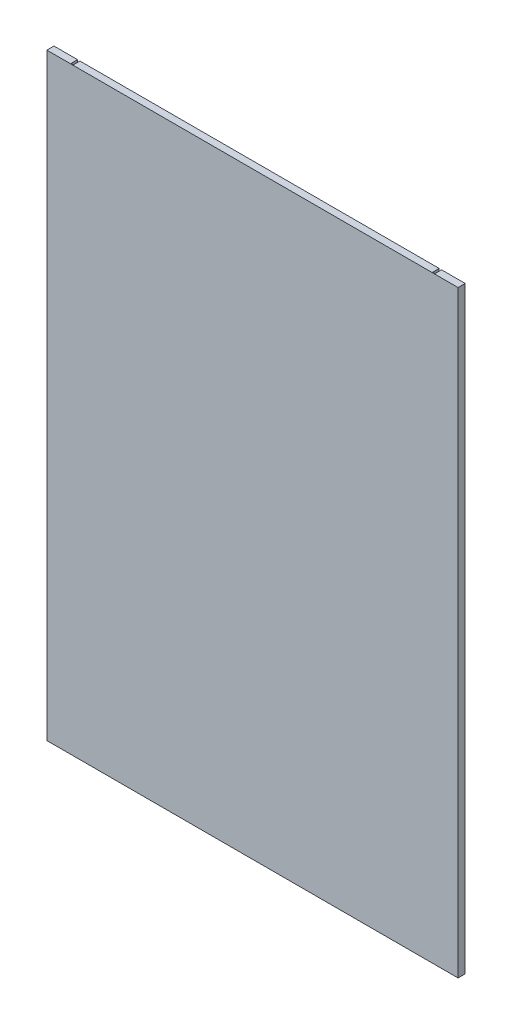
ISO-10303-21;
HEADER;
FILE_DESCRIPTION(('STEP AP214'),'2;1');
FILE_NAME('part.step','',(''),(''),'','','');
FILE_SCHEMA(('AUTOMOTIVE_DESIGN { 1 0 10303 214 1 1 1 1 }'));
ENDSEC;
DATA;
#1=APPLICATION_CONTEXT('core data for automotive mechanical design processes');
#2=APPLICATION_PROTOCOL_DEFINITION('international standard','automotive_design',2000,#1);
#3=PRODUCT_CONTEXT('',#1,'mechanical');
#4=PRODUCT('Part','Part','',(#3));
#5=PRODUCT_RELATED_PRODUCT_CATEGORY('part','',(#4));
#6=PRODUCT_DEFINITION_FORMATION('','',#4);
#7=PRODUCT_DEFINITION_CONTEXT('part definition',#1,'design');
#8=PRODUCT_DEFINITION('design','',#6,#7);
#9=PRODUCT_DEFINITION_SHAPE('','',#8);
#10=(LENGTH_UNIT() NAMED_UNIT(*) SI_UNIT(.MILLI.,.METRE.));
#11=(NAMED_UNIT(*) PLANE_ANGLE_UNIT() SI_UNIT($,.RADIAN.));
#12=(NAMED_UNIT(*) SI_UNIT($,.STERADIAN.) SOLID_ANGLE_UNIT());
#13=UNCERTAINTY_MEASURE_WITH_UNIT(LENGTH_MEASURE(1.E-05),#10,'distance_accuracy_value','');
#14=(GEOMETRIC_REPRESENTATION_CONTEXT(3) GLOBAL_UNCERTAINTY_ASSIGNED_CONTEXT((#13)) GLOBAL_UNIT_ASSIGNED_CONTEXT((#10,
#11,#12)) REPRESENTATION_CONTEXT('',''));
#15=CARTESIAN_POINT('',(0.,0.,0.));
#16=DIRECTION('',(0.,0.,1.));
#17=DIRECTION('',(1.,0.,0.));
#18=AXIS2_PLACEMENT_3D('',#15,#16,#17);
#19=CARTESIAN_POINT('',(87.,253.,0.));
#20=DIRECTION('',(0.,0.,-1.));
#21=DIRECTION('',(-1.,0.,0.));
#22=AXIS2_PLACEMENT_3D('',#19,#20,#21);
#23=PLANE('',#22);
#24=DIRECTION('',(1.,0.,0.));
#25=VECTOR('',#24,1.);
#26=CARTESIAN_POINT('',(87.,0.,0.));
#27=LINE('',#26,#25);
#28=CARTESIAN_POINT('',(-87.,0.,0.));
#29=VERTEX_POINT('',#28);
#30=CARTESIAN_POINT('',(87.,0.,0.));
#31=VERTEX_POINT('',#30);
#32=EDGE_CURVE('E157',#29,#31,#27,.T.);
#33=ORIENTED_EDGE('',*,*,#32,.T.);
#34=DIRECTION('',(0.,-1.,0.));
#35=VECTOR('',#34,1.);
#36=CARTESIAN_POINT('',(87.,253.,0.));
#37=LINE('',#36,#35);
#38=CARTESIAN_POINT('',(87.,253.,0.));
#39=VERTEX_POINT('',#38);
#40=EDGE_CURVE('E11',#39,#31,#37,.T.);
#41=ORIENTED_EDGE('',*,*,#40,.F.);
#42=DIRECTION('',(1.,0.,0.));
#43=VECTOR('',#42,1.);
#44=CARTESIAN_POINT('',(87.,253.,0.));
#45=LINE('',#44,#43);
#46=CARTESIAN_POINT('',(-87.,253.,0.));
#47=VERTEX_POINT('',#46);
#48=EDGE_CURVE('E179',#47,#39,#45,.T.);
#49=ORIENTED_EDGE('',*,*,#48,.F.);
#50=DIRECTION('',(0.,-1.,0.));
#51=VECTOR('',#50,1.);
#52=CARTESIAN_POINT('',(-87.,253.,0.));
#53=LINE('',#52,#51);
#54=EDGE_CURVE('E153',#47,#29,#53,.T.);
#55=ORIENTED_EDGE('',*,*,#54,.T.);
#56=EDGE_LOOP('',(#33,#41,#49,#55));
#57=FACE_BOUND('',#56,.T.);
#58=ADVANCED_FACE('F37',(#57),#23,.F.);
#59=CARTESIAN_POINT('',(87.,253.,-2.99999999999998));
#60=DIRECTION('',(-1.,0.,0.));
#61=DIRECTION('',(0.,0.,1.));
#62=AXIS2_PLACEMENT_3D('',#59,#60,#61);
#63=PLANE('',#62);
#64=DIRECTION('',(0.,0.,-1.));
#65=VECTOR('',#64,1.);
#66=CARTESIAN_POINT('',(87.,0.,-2.99999999999998));
#67=LINE('',#66,#65);
#68=CARTESIAN_POINT('',(87.,0.,-2.99999999999998));
#69=VERTEX_POINT('',#68);
#70=EDGE_CURVE('E160',#31,#69,#67,.T.);
#71=ORIENTED_EDGE('',*,*,#70,.T.);
#72=DIRECTION('',(0.,-1.,0.));
#73=VECTOR('',#72,1.);
#74=CARTESIAN_POINT('',(87.,253.,-2.99999999999998));
#75=LINE('',#74,#73);
#76=CARTESIAN_POINT('',(87.,253.,-2.99999999999998));
#77=VERTEX_POINT('',#76);
#78=EDGE_CURVE('E45',#77,#69,#75,.T.);
#79=ORIENTED_EDGE('',*,*,#78,.F.);
#80=DIRECTION('',(0.,0.,-1.));
#81=VECTOR('',#80,1.);
#82=CARTESIAN_POINT('',(87.,253.,-2.99999999999998));
#83=LINE('',#82,#81);
#84=EDGE_CURVE('E108',#39,#77,#83,.T.);
#85=ORIENTED_EDGE('',*,*,#84,.F.);
#86=ORIENTED_EDGE('',*,*,#40,.T.);
#87=EDGE_LOOP('',(#71,#79,#85,#86));
#88=FACE_BOUND('',#87,.T.);
#89=ADVANCED_FACE('F257',(#88),#63,.F.);
#90=CARTESIAN_POINT('',(77.,253.,-2.99999999999998));
#91=DIRECTION('',(0.,0.,1.));
#92=DIRECTION('',(1.,0.,0.));
#93=AXIS2_PLACEMENT_3D('',#90,#91,#92);
#94=PLANE('',#93);
#95=DIRECTION('',(-1.,0.,0.));
#96=VECTOR('',#95,1.);
#97=CARTESIAN_POINT('',(77.,0.,-2.99999999999998));
#98=LINE('',#97,#96);
#99=CARTESIAN_POINT('',(77.,0.,-2.99999999999998));
#100=VERTEX_POINT('',#99);
#101=EDGE_CURVE('E162',#69,#100,#98,.T.);
#102=ORIENTED_EDGE('',*,*,#101,.T.);
#103=DIRECTION('',(0.,-1.,0.));
#104=VECTOR('',#103,1.);
#105=CARTESIAN_POINT('',(77.,253.,-2.99999999999998));
#106=LINE('',#105,#104);
#107=CARTESIAN_POINT('',(77.,253.,-2.99999999999998));
#108=VERTEX_POINT('',#107);
#109=EDGE_CURVE('E198',#108,#100,#106,.T.);
#110=ORIENTED_EDGE('',*,*,#109,.F.);
#111=DIRECTION('',(-1.,0.,0.));
#112=VECTOR('',#111,1.);
#113=CARTESIAN_POINT('',(77.,253.,-2.99999999999998));
#114=LINE('',#113,#112);
#115=EDGE_CURVE('E206',#77,#108,#114,.T.);
#116=ORIENTED_EDGE('',*,*,#115,.F.);
#117=ORIENTED_EDGE('',*,*,#78,.T.);
#118=EDGE_LOOP('',(#102,#110,#116,#117));
#119=FACE_BOUND('',#118,.T.);
#120=ADVANCED_FACE('F204',(#119),#94,.F.);
#121=CARTESIAN_POINT('',(77.,253.,-0.19999999999998));
#122=DIRECTION('',(1.,0.,0.));
#123=DIRECTION('',(0.,0.,-1.));
#124=AXIS2_PLACEMENT_3D('',#121,#122,#123);
#125=PLANE('',#124);
#126=DIRECTION('',(0.,0.,1.));
#127=VECTOR('',#126,1.);
#128=CARTESIAN_POINT('',(77.,0.,-0.19999999999998));
#129=LINE('',#128,#127);
#130=CARTESIAN_POINT('',(77.,0.,-0.19999999999998));
#131=VERTEX_POINT('',#130);
#132=EDGE_CURVE('E164',#100,#131,#129,.T.);
#133=ORIENTED_EDGE('',*,*,#132,.T.);
#134=DIRECTION('',(0.,-1.,0.));
#135=VECTOR('',#134,1.);
#136=CARTESIAN_POINT('',(77.,253.,-0.19999999999998));
#137=LINE('',#136,#135);
#138=CARTESIAN_POINT('',(77.,253.,-0.19999999999998));
#139=VERTEX_POINT('',#138);
#140=EDGE_CURVE('E195',#139,#131,#137,.T.);
#141=ORIENTED_EDGE('',*,*,#140,.F.);
#142=DIRECTION('',(0.,0.,1.));
#143=VECTOR('',#142,1.);
#144=CARTESIAN_POINT('',(77.,253.,-0.19999999999998));
#145=LINE('',#144,#143);
#146=EDGE_CURVE('E224',#108,#139,#145,.T.);
#147=ORIENTED_EDGE('',*,*,#146,.F.);
#148=ORIENTED_EDGE('',*,*,#109,.T.);
#149=EDGE_LOOP('',(#133,#141,#147,#148));
#150=FACE_BOUND('',#149,.T.);
#151=ADVANCED_FACE('F215',(#150),#125,.F.);
#152=CARTESIAN_POINT('',(76.,253.,-0.199999999999991));
#153=DIRECTION('',(0.,0.,1.));
#154=DIRECTION('',(1.,0.,0.));
#155=AXIS2_PLACEMENT_3D('',#152,#153,#154);
#156=PLANE('',#155);
#157=DIRECTION('',(-1.,0.,0.));
#158=VECTOR('',#157,1.);
#159=CARTESIAN_POINT('',(76.,0.,-0.199999999999991));
#160=LINE('',#159,#158);
#161=CARTESIAN_POINT('',(76.,0.,-0.199999999999991));
#162=VERTEX_POINT('',#161);
#163=EDGE_CURVE('E166',#131,#162,#160,.T.);
#164=ORIENTED_EDGE('',*,*,#163,.T.);
#165=DIRECTION('',(0.,-1.,0.));
#166=VECTOR('',#165,1.);
#167=CARTESIAN_POINT('',(76.,253.,-0.199999999999991));
#168=LINE('',#167,#166);
#169=CARTESIAN_POINT('',(76.,253.,-0.199999999999991));
#170=VERTEX_POINT('',#169);
#171=EDGE_CURVE('E192',#170,#162,#168,.T.);
#172=ORIENTED_EDGE('',*,*,#171,.F.);
#173=DIRECTION('',(-1.,0.,0.));
#174=VECTOR('',#173,1.);
#175=CARTESIAN_POINT('',(76.,253.,-0.199999999999991));
#176=LINE('',#175,#174);
#177=EDGE_CURVE('E221',#139,#170,#176,.T.);
#178=ORIENTED_EDGE('',*,*,#177,.F.);
#179=ORIENTED_EDGE('',*,*,#140,.T.);
#180=EDGE_LOOP('',(#164,#172,#178,#179));
#181=FACE_BOUND('',#180,.T.);
#182=ADVANCED_FACE('F219',(#181),#156,.F.);
#183=CARTESIAN_POINT('',(76.,253.,-2.99999999999999));
#184=DIRECTION('',(-1.,0.,0.));
#185=DIRECTION('',(0.,0.,1.));
#186=AXIS2_PLACEMENT_3D('',#183,#184,#185);
#187=PLANE('',#186);
#188=DIRECTION('',(0.,0.,-1.));
#189=VECTOR('',#188,1.);
#190=CARTESIAN_POINT('',(76.,0.,-2.99999999999999));
#191=LINE('',#190,#189);
#192=CARTESIAN_POINT('',(76.,0.,-2.99999999999999));
#193=VERTEX_POINT('',#192);
#194=EDGE_CURVE('E168',#162,#193,#191,.T.);
#195=ORIENTED_EDGE('',*,*,#194,.T.);
#196=DIRECTION('',(0.,-1.,0.));
#197=VECTOR('',#196,1.);
#198=CARTESIAN_POINT('',(76.,253.,-2.99999999999999));
#199=LINE('',#198,#197);
#200=CARTESIAN_POINT('',(76.,253.,-2.99999999999999));
#201=VERTEX_POINT('',#200);
#202=EDGE_CURVE('E189',#201,#193,#199,.T.);
#203=ORIENTED_EDGE('',*,*,#202,.F.);
#204=DIRECTION('',(0.,0.,-1.));
#205=VECTOR('',#204,1.);
#206=CARTESIAN_POINT('',(76.,253.,-2.99999999999999));
#207=LINE('',#206,#205);
#208=EDGE_CURVE('E223',#170,#201,#207,.T.);
#209=ORIENTED_EDGE('',*,*,#208,.F.);
#210=ORIENTED_EDGE('',*,*,#171,.T.);
#211=EDGE_LOOP('',(#195,#203,#209,#210));
#212=FACE_BOUND('',#211,.T.);
#213=ADVANCED_FACE('F270',(#212),#187,.F.);
#214=CARTESIAN_POINT('',(-76.,253.,-2.99999999999999));
#215=DIRECTION('',(0.,0.,1.));
#216=DIRECTION('',(1.,0.,0.));
#217=AXIS2_PLACEMENT_3D('',#214,#215,#216);
#218=PLANE('',#217);
#219=DIRECTION('',(-1.,0.,0.));
#220=VECTOR('',#219,1.);
#221=CARTESIAN_POINT('',(-76.,0.,-2.99999999999999));
#222=LINE('',#221,#220);
#223=CARTESIAN_POINT('',(-76.,0.,-2.99999999999999));
#224=VERTEX_POINT('',#223);
#225=EDGE_CURVE('E170',#193,#224,#222,.T.);
#226=ORIENTED_EDGE('',*,*,#225,.T.);
#227=DIRECTION('',(0.,-1.,0.));
#228=VECTOR('',#227,1.);
#229=CARTESIAN_POINT('',(-76.,253.,-2.99999999999999));
#230=LINE('',#229,#228);
#231=CARTESIAN_POINT('',(-76.,253.,-2.99999999999999));
#232=VERTEX_POINT('',#231);
#233=EDGE_CURVE('E186',#232,#224,#230,.T.);
#234=ORIENTED_EDGE('',*,*,#233,.F.);
#235=DIRECTION('',(-1.,0.,0.));
#236=VECTOR('',#235,1.);
#237=CARTESIAN_POINT('',(-76.,253.,-2.99999999999999));
#238=LINE('',#237,#236);
#239=EDGE_CURVE('E226',#201,#232,#238,.T.);
#240=ORIENTED_EDGE('',*,*,#239,.F.);
#241=ORIENTED_EDGE('',*,*,#202,.T.);
#242=EDGE_LOOP('',(#226,#234,#240,#241));
#243=FACE_BOUND('',#242,.T.);
#244=ADVANCED_FACE('F273',(#243),#218,.F.);
#245=CARTESIAN_POINT('',(-76.,253.,-0.199999999999991));
#246=DIRECTION('',(1.,0.,0.));
#247=DIRECTION('',(0.,0.,-1.));
#248=AXIS2_PLACEMENT_3D('',#245,#246,#247);
#249=PLANE('',#248);
#250=DIRECTION('',(0.,0.,1.));
#251=VECTOR('',#250,1.);
#252=CARTESIAN_POINT('',(-76.,0.,-0.199999999999991));
#253=LINE('',#252,#251);
#254=CARTESIAN_POINT('',(-76.,0.,-0.199999999999991));
#255=VERTEX_POINT('',#254);
#256=EDGE_CURVE('E172',#224,#255,#253,.T.);
#257=ORIENTED_EDGE('',*,*,#256,.T.);
#258=DIRECTION('',(0.,-1.,0.));
#259=VECTOR('',#258,1.);
#260=CARTESIAN_POINT('',(-76.,253.,-0.199999999999991));
#261=LINE('',#260,#259);
#262=CARTESIAN_POINT('',(-76.,253.,-0.199999999999991));
#263=VERTEX_POINT('',#262);
#264=EDGE_CURVE('E183',#263,#255,#261,.T.);
#265=ORIENTED_EDGE('',*,*,#264,.F.);
#266=DIRECTION('',(0.,0.,1.));
#267=VECTOR('',#266,1.);
#268=CARTESIAN_POINT('',(-76.,253.,-0.199999999999991));
#269=LINE('',#268,#267);
#270=EDGE_CURVE('E232',#232,#263,#269,.T.);
#271=ORIENTED_EDGE('',*,*,#270,.F.);
#272=ORIENTED_EDGE('',*,*,#233,.T.);
#273=EDGE_LOOP('',(#257,#265,#271,#272));
#274=FACE_BOUND('',#273,.T.);
#275=ADVANCED_FACE('F238',(#274),#249,.F.);
#276=CARTESIAN_POINT('',(-77.,253.,-0.19999999999998));
#277=DIRECTION('',(0.,0.,1.));
#278=DIRECTION('',(1.,0.,0.));
#279=AXIS2_PLACEMENT_3D('',#276,#277,#278);
#280=PLANE('',#279);
#281=DIRECTION('',(-1.,0.,0.));
#282=VECTOR('',#281,1.);
#283=CARTESIAN_POINT('',(-77.,0.,-0.19999999999998));
#284=LINE('',#283,#282);
#285=CARTESIAN_POINT('',(-77.,0.,-0.19999999999998));
#286=VERTEX_POINT('',#285);
#287=EDGE_CURVE('E174',#255,#286,#284,.T.);
#288=ORIENTED_EDGE('',*,*,#287,.T.);
#289=DIRECTION('',(0.,-1.,0.));
#290=VECTOR('',#289,1.);
#291=CARTESIAN_POINT('',(-77.,253.,-0.19999999999998));
#292=LINE('',#291,#290);
#293=CARTESIAN_POINT('',(-77.,253.,-0.19999999999998));
#294=VERTEX_POINT('',#293);
#295=EDGE_CURVE('E148',#294,#286,#292,.T.);
#296=ORIENTED_EDGE('',*,*,#295,.F.);
#297=DIRECTION('',(-1.,0.,0.));
#298=VECTOR('',#297,1.);
#299=CARTESIAN_POINT('',(-77.,253.,-0.19999999999998));
#300=LINE('',#299,#298);
#301=EDGE_CURVE('E139',#263,#294,#300,.T.);
#302=ORIENTED_EDGE('',*,*,#301,.F.);
#303=ORIENTED_EDGE('',*,*,#264,.T.);
#304=EDGE_LOOP('',(#288,#296,#302,#303));
#305=FACE_BOUND('',#304,.T.);
#306=ADVANCED_FACE('F242',(#305),#280,.F.);
#307=CARTESIAN_POINT('',(-77.,253.,-2.99999999999998));
#308=DIRECTION('',(-1.,0.,0.));
#309=DIRECTION('',(0.,0.,1.));
#310=AXIS2_PLACEMENT_3D('',#307,#308,#309);
#311=PLANE('',#310);
#312=DIRECTION('',(0.,0.,-1.));
#313=VECTOR('',#312,1.);
#314=CARTESIAN_POINT('',(-77.,0.,-2.99999999999998));
#315=LINE('',#314,#313);
#316=CARTESIAN_POINT('',(-77.,0.,-2.99999999999998));
#317=VERTEX_POINT('',#316);
#318=EDGE_CURVE('E147',#286,#317,#315,.T.);
#319=ORIENTED_EDGE('',*,*,#318,.T.);
#320=DIRECTION('',(0.,-1.,0.));
#321=VECTOR('',#320,1.);
#322=CARTESIAN_POINT('',(-77.,253.,-2.99999999999998));
#323=LINE('',#322,#321);
#324=CARTESIAN_POINT('',(-77.,253.,-2.99999999999998));
#325=VERTEX_POINT('',#324);
#326=EDGE_CURVE('E144',#325,#317,#323,.T.);
#327=ORIENTED_EDGE('',*,*,#326,.F.);
#328=DIRECTION('',(0.,0.,-1.));
#329=VECTOR('',#328,1.);
#330=CARTESIAN_POINT('',(-77.,253.,-2.99999999999998));
#331=LINE('',#330,#329);
#332=EDGE_CURVE('E133',#294,#325,#331,.T.);
#333=ORIENTED_EDGE('',*,*,#332,.F.);
#334=ORIENTED_EDGE('',*,*,#295,.T.);
#335=EDGE_LOOP('',(#319,#327,#333,#334));
#336=FACE_BOUND('',#335,.T.);
#337=ADVANCED_FACE('F145',(#336),#311,.F.);
#338=CARTESIAN_POINT('',(-87.,253.,-2.99999999999998));
#339=DIRECTION('',(0.,0.,1.));
#340=DIRECTION('',(1.,0.,0.));
#341=AXIS2_PLACEMENT_3D('',#338,#339,#340);
#342=PLANE('',#341);
#343=DIRECTION('',(-1.,0.,0.));
#344=VECTOR('',#343,1.);
#345=CARTESIAN_POINT('',(-87.,0.,-2.99999999999998));
#346=LINE('',#345,#344);
#347=CARTESIAN_POINT('',(-87.,0.,-2.99999999999998));
#348=VERTEX_POINT('',#347);
#349=EDGE_CURVE('E94',#317,#348,#346,.T.);
#350=ORIENTED_EDGE('',*,*,#349,.T.);
#351=DIRECTION('',(0.,-1.,0.));
#352=VECTOR('',#351,1.);
#353=CARTESIAN_POINT('',(-87.,253.,-2.99999999999998));
#354=LINE('',#353,#352);
#355=CARTESIAN_POINT('',(-87.,253.,-2.99999999999998));
#356=VERTEX_POINT('',#355);
#357=EDGE_CURVE('E149',#356,#348,#354,.T.);
#358=ORIENTED_EDGE('',*,*,#357,.F.);
#359=DIRECTION('',(-1.,0.,0.));
#360=VECTOR('',#359,1.);
#361=CARTESIAN_POINT('',(-87.,253.,-2.99999999999998));
#362=LINE('',#361,#360);
#363=EDGE_CURVE('E137',#325,#356,#362,.T.);
#364=ORIENTED_EDGE('',*,*,#363,.F.);
#365=ORIENTED_EDGE('',*,*,#326,.T.);
#366=EDGE_LOOP('',(#350,#358,#364,#365));
#367=FACE_BOUND('',#366,.T.);
#368=ADVANCED_FACE('F151',(#367),#342,.F.);
#369=CARTESIAN_POINT('',(-87.,253.,0.));
#370=DIRECTION('',(1.,0.,0.));
#371=DIRECTION('',(0.,0.,-1.));
#372=AXIS2_PLACEMENT_3D('',#369,#370,#371);
#373=PLANE('',#372);
#374=DIRECTION('',(0.,0.,1.));
#375=VECTOR('',#374,1.);
#376=CARTESIAN_POINT('',(-87.,0.,0.));
#377=LINE('',#376,#375);
#378=EDGE_CURVE('E100',#348,#29,#377,.T.);
#379=ORIENTED_EDGE('',*,*,#378,.T.);
#380=ORIENTED_EDGE('',*,*,#54,.F.);
#381=DIRECTION('',(0.,0.,1.));
#382=VECTOR('',#381,1.);
#383=CARTESIAN_POINT('',(-87.,253.,0.));
#384=LINE('',#383,#382);
#385=EDGE_CURVE('E53',#356,#47,#384,.T.);
#386=ORIENTED_EDGE('',*,*,#385,.F.);
#387=ORIENTED_EDGE('',*,*,#357,.T.);
#388=EDGE_LOOP('',(#379,#380,#386,#387));
#389=FACE_BOUND('',#388,.T.);
#390=ADVANCED_FACE('F246',(#389),#373,.F.);
#391=CARTESIAN_POINT('',(0.,253.,0.));
#392=DIRECTION('',(0.,-1.,0.));
#393=DIRECTION('',(0.,0.,-1.));
#394=AXIS2_PLACEMENT_3D('',#391,#392,#393);
#395=PLANE('',#394);
#396=ORIENTED_EDGE('',*,*,#48,.T.);
#397=ORIENTED_EDGE('',*,*,#84,.T.);
#398=ORIENTED_EDGE('',*,*,#115,.T.);
#399=ORIENTED_EDGE('',*,*,#146,.T.);
#400=ORIENTED_EDGE('',*,*,#177,.T.);
#401=ORIENTED_EDGE('',*,*,#208,.T.);
#402=ORIENTED_EDGE('',*,*,#239,.T.);
#403=ORIENTED_EDGE('',*,*,#270,.T.);
#404=ORIENTED_EDGE('',*,*,#301,.T.);
#405=ORIENTED_EDGE('',*,*,#332,.T.);
#406=ORIENTED_EDGE('',*,*,#363,.T.);
#407=ORIENTED_EDGE('',*,*,#385,.T.);
#408=EDGE_LOOP('',(#396,#397,#398,#399,#400,#401,#402,#403,#404,#405,#406,#407));
#409=FACE_BOUND('',#408,.T.);
#410=ADVANCED_FACE('F135',(#409),#395,.F.);
#411=CARTESIAN_POINT('',(0.,0.,0.));
#412=DIRECTION('',(0.,-1.,0.));
#413=DIRECTION('',(0.,0.,-1.));
#414=AXIS2_PLACEMENT_3D('',#411,#412,#413);
#415=PLANE('',#414);
#416=ORIENTED_EDGE('',*,*,#32,.F.);
#417=ORIENTED_EDGE('',*,*,#378,.F.);
#418=ORIENTED_EDGE('',*,*,#349,.F.);
#419=ORIENTED_EDGE('',*,*,#318,.F.);
#420=ORIENTED_EDGE('',*,*,#287,.F.);
#421=ORIENTED_EDGE('',*,*,#256,.F.);
#422=ORIENTED_EDGE('',*,*,#225,.F.);
#423=ORIENTED_EDGE('',*,*,#194,.F.);
#424=ORIENTED_EDGE('',*,*,#163,.F.);
#425=ORIENTED_EDGE('',*,*,#132,.F.);
#426=ORIENTED_EDGE('',*,*,#101,.F.);
#427=ORIENTED_EDGE('',*,*,#70,.F.);
#428=EDGE_LOOP('',(#416,#417,#418,#419,#420,#421,#422,#423,#424,#425,#426,#427));
#429=FACE_BOUND('',#428,.T.);
#430=ADVANCED_FACE('F210',(#429),#415,.T.);
#431=CLOSED_SHELL('',(#58,#89,#120,#151,#182,#213,#244,#275,#306,#337,#368,#390,#410,#430));
#432=MANIFOLD_SOLID_BREP('B2',#431);
#433=ADVANCED_BREP_SHAPE_REPRESENTATION('',(#18,#432),#14);
#434=SHAPE_DEFINITION_REPRESENTATION(#9,#433);
ENDSEC;
END-ISO-10303-21;
